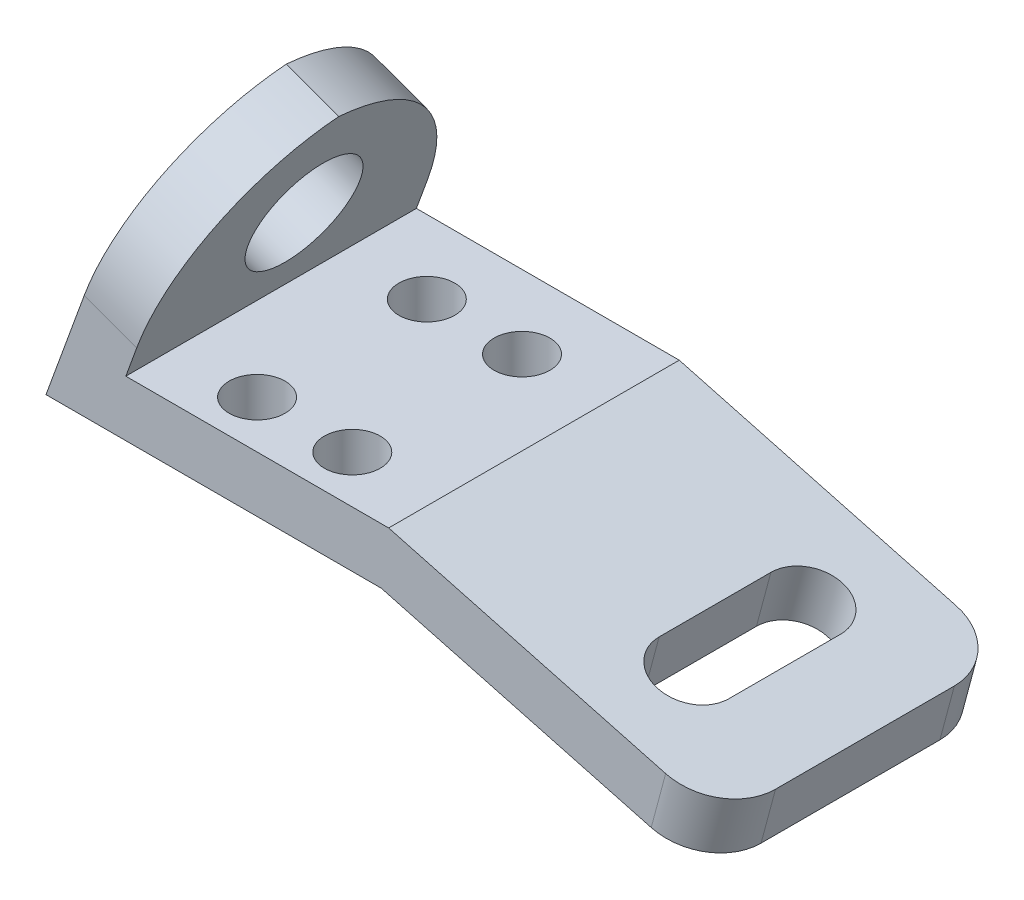
ISO-10303-21;
HEADER;
FILE_DESCRIPTION(('STEP AP214'),'2;1');
FILE_NAME('part.step','',(''),(''),'','','');
FILE_SCHEMA(('AUTOMOTIVE_DESIGN { 1 0 10303 214 1 1 1 1 }'));
ENDSEC;
DATA;
#1=APPLICATION_CONTEXT('core data for automotive mechanical design processes');
#2=APPLICATION_PROTOCOL_DEFINITION('international standard','automotive_design',2000,#1);
#3=PRODUCT_CONTEXT('',#1,'mechanical');
#4=PRODUCT('Part','Part','',(#3));
#5=PRODUCT_RELATED_PRODUCT_CATEGORY('part','',(#4));
#6=PRODUCT_DEFINITION_FORMATION('','',#4);
#7=PRODUCT_DEFINITION_CONTEXT('part definition',#1,'design');
#8=PRODUCT_DEFINITION('design','',#6,#7);
#9=PRODUCT_DEFINITION_SHAPE('','',#8);
#10=(LENGTH_UNIT() NAMED_UNIT(*) SI_UNIT(.MILLI.,.METRE.));
#11=(NAMED_UNIT(*) PLANE_ANGLE_UNIT() SI_UNIT($,.RADIAN.));
#12=(NAMED_UNIT(*) SI_UNIT($,.STERADIAN.) SOLID_ANGLE_UNIT());
#13=UNCERTAINTY_MEASURE_WITH_UNIT(LENGTH_MEASURE(1.E-05),#10,'distance_accuracy_value','');
#14=(GEOMETRIC_REPRESENTATION_CONTEXT(3) GLOBAL_UNCERTAINTY_ASSIGNED_CONTEXT((#13)) GLOBAL_UNIT_ASSIGNED_CONTEXT((#10,
#11,#12)) REPRESENTATION_CONTEXT('',''));
#15=CARTESIAN_POINT('',(0.,0.,0.));
#16=DIRECTION('',(0.,0.,1.));
#17=DIRECTION('',(1.,0.,0.));
#18=AXIS2_PLACEMENT_3D('',#15,#16,#17);
#19=CARTESIAN_POINT('',(9.3969262078591,-3.42020143325666,52.));
#20=DIRECTION('',(-0.93969262078591,0.342020143325666,0.));
#21=DIRECTION('',(-0.342020143325666,-0.93969262078591,0.));
#22=AXIS2_PLACEMENT_3D('',#19,#20,#21);
#23=PLANE('',#22);
#24=CARTESIAN_POINT('',(19.6575305076291,24.7705771903206,25.4846685991559));
#25=DIRECTION('',(-0.93969262078591,0.342020143325666,0.));
#26=DIRECTION('',(-0.342020143325666,-0.93969262078591,0.));
#27=AXIS2_PLACEMENT_3D('',#24,#25,#26);
#28=CIRCLE('',#27,10.);
#29=CARTESIAN_POINT('',(16.2373290743724,15.3736509824615,25.4846685991559));
#30=VERTEX_POINT('',#29);
#31=EDGE_CURVE('E192',#30,#30,#28,.T.);
#32=ORIENTED_EDGE('',*,*,#31,.T.);
#33=EDGE_LOOP('',(#32));
#34=FACE_BOUND('',#33,.T.);
#35=DIRECTION('',(0.342020143325666,0.93969262078591,0.));
#36=VECTOR('',#35,1.);
#37=CARTESIAN_POINT('',(9.3969262078591,-3.42020143325666,0.));
#38=LINE('',#37,#36);
#39=CARTESIAN_POINT('',(14.2814800674211,10.,0.));
#40=VERTEX_POINT('',#39);
#41=CARTESIAN_POINT('',(16.2373290743724,15.3736509824616,0.));
#42=VERTEX_POINT('',#41);
#43=EDGE_CURVE('E195',#40,#42,#38,.T.);
#44=ORIENTED_EDGE('',*,*,#43,.T.);
#45=CARTESIAN_POINT('',(16.2373290743724,15.3736509824615,30.));
#46=DIRECTION('',(-0.93969262078591,0.342020143325666,0.));
#47=DIRECTION('',(-0.342020143325666,-0.93969262078591,0.));
#48=AXIS2_PLACEMENT_3D('',#45,#46,#47);
#49=CIRCLE('',#48,30.);
#50=CARTESIAN_POINT('',(26.4063190016666,43.312721186364,26.));
#51=VERTEX_POINT('',#50);
#52=EDGE_CURVE('E248',#42,#51,#49,.F.);
#53=ORIENTED_EDGE('',*,*,#52,.T.);
#54=CARTESIAN_POINT('',(16.2373290743724,15.3736509824615,22.));
#55=DIRECTION('',(-0.93969262078591,0.342020143325666,0.));
#56=DIRECTION('',(-0.342020143325666,-0.93969262078591,0.));
#57=AXIS2_PLACEMENT_3D('',#54,#55,#56);
#58=CIRCLE('',#57,30.);
#59=CARTESIAN_POINT('',(16.2373290743724,15.3736509824615,52.));
#60=VERTEX_POINT('',#59);
#61=EDGE_CURVE('E246',#51,#60,#58,.F.);
#62=ORIENTED_EDGE('',*,*,#61,.T.);
#63=DIRECTION('',(0.342020143325666,0.93969262078591,0.));
#64=VECTOR('',#63,1.);
#65=CARTESIAN_POINT('',(9.3969262078591,-3.42020143325666,52.));
#66=LINE('',#65,#64);
#67=CARTESIAN_POINT('',(14.2814800674211,10.,52.));
#68=VERTEX_POINT('',#67);
#69=EDGE_CURVE('E199',#68,#60,#66,.T.);
#70=ORIENTED_EDGE('',*,*,#69,.F.);
#71=DIRECTION('',(0.,0.,-1.));
#72=VECTOR('',#71,1.);
#73=CARTESIAN_POINT('',(14.2814800674211,10.,52.));
#74=LINE('',#73,#72);
#75=EDGE_CURVE('E215',#68,#40,#74,.T.);
#76=ORIENTED_EDGE('',*,*,#75,.T.);
#77=EDGE_LOOP('',(#44,#53,#62,#70,#76));
#78=FACE_BOUND('',#77,.T.);
#79=ADVANCED_FACE('F37',(#34,#78),#23,.F.);
#80=CARTESIAN_POINT('',(0.,0.,52.));
#81=DIRECTION('',(-0.93969262078591,0.342020143325666,0.));
#82=DIRECTION('',(-0.342020143325666,-0.93969262078591,0.));
#83=AXIS2_PLACEMENT_3D('',#80,#81,#82);
#84=PLANE('',#83);
#85=CARTESIAN_POINT('',(10.26060429977,28.1907786235773,25.4846685991559));
#86=DIRECTION('',(-0.93969262078591,0.342020143325666,0.));
#87=DIRECTION('',(-0.342020143325666,-0.93969262078591,0.));
#88=AXIS2_PLACEMENT_3D('',#85,#86,#87);
#89=CIRCLE('',#88,10.);
#90=CARTESIAN_POINT('',(6.84040286651331,18.7938524157182,25.4846685991559));
#91=VERTEX_POINT('',#90);
#92=EDGE_CURVE('E196',#91,#91,#89,.T.);
#93=ORIENTED_EDGE('',*,*,#92,.F.);
#94=EDGE_LOOP('',(#93));
#95=FACE_BOUND('',#94,.T.);
#96=CARTESIAN_POINT('',(6.84040286651331,18.7938524157182,22.));
#97=DIRECTION('',(-0.93969262078591,0.342020143325666,0.));
#98=DIRECTION('',(-0.342020143325666,-0.93969262078591,0.));
#99=AXIS2_PLACEMENT_3D('',#96,#97,#98);
#100=CIRCLE('',#99,30.);
#101=CARTESIAN_POINT('',(6.84040286651331,18.7938524157182,52.));
#102=VERTEX_POINT('',#101);
#103=CARTESIAN_POINT('',(17.0093927938075,46.7329226196207,26.));
#104=VERTEX_POINT('',#103);
#105=EDGE_CURVE('E250',#102,#104,#100,.T.);
#106=ORIENTED_EDGE('',*,*,#105,.T.);
#107=CARTESIAN_POINT('',(6.84040286651331,18.7938524157182,30.));
#108=DIRECTION('',(-0.93969262078591,0.342020143325666,0.));
#109=DIRECTION('',(-0.342020143325666,-0.93969262078591,0.));
#110=AXIS2_PLACEMENT_3D('',#107,#108,#109);
#111=CIRCLE('',#110,30.);
#112=CARTESIAN_POINT('',(6.84040286651331,18.7938524157182,0.));
#113=VERTEX_POINT('',#112);
#114=EDGE_CURVE('E252',#104,#113,#111,.T.);
#115=ORIENTED_EDGE('',*,*,#114,.T.);
#116=DIRECTION('',(0.342020143325666,0.93969262078591,0.));
#117=VECTOR('',#116,1.);
#118=CARTESIAN_POINT('',(0.,0.,0.));
#119=LINE('',#118,#117);
#120=CARTESIAN_POINT('',(0.,0.,0.));
#121=VERTEX_POINT('',#120);
#122=EDGE_CURVE('E218',#121,#113,#119,.T.);
#123=ORIENTED_EDGE('',*,*,#122,.F.);
#124=DIRECTION('',(0.,0.,-1.));
#125=VECTOR('',#124,1.);
#126=CARTESIAN_POINT('',(0.,0.,52.));
#127=LINE('',#126,#125);
#128=CARTESIAN_POINT('',(0.,0.,52.));
#129=VERTEX_POINT('',#128);
#130=EDGE_CURVE('E241',#129,#121,#127,.T.);
#131=ORIENTED_EDGE('',*,*,#130,.F.);
#132=DIRECTION('',(0.342020143325666,0.93969262078591,0.));
#133=VECTOR('',#132,1.);
#134=CARTESIAN_POINT('',(0.,0.,52.));
#135=LINE('',#134,#133);
#136=EDGE_CURVE('E202',#129,#102,#135,.T.);
#137=ORIENTED_EDGE('',*,*,#136,.T.);
#138=EDGE_LOOP('',(#106,#115,#123,#131,#137));
#139=FACE_BOUND('',#138,.T.);
#140=ADVANCED_FACE('F309',(#95,#139),#84,.T.);
#141=CARTESIAN_POINT('',(0.,0.,52.));
#142=DIRECTION('',(0.,-1.,0.));
#143=DIRECTION('',(0.,0.,-1.));
#144=AXIS2_PLACEMENT_3D('',#141,#142,#143);
#145=PLANE('',#144);
#146=CARTESIAN_POINT('',(46.316524975874,0.,43.5069921991129));
#147=DIRECTION('',(0.,1.,0.));
#148=DIRECTION('',(0.,0.,1.));
#149=AXIS2_PLACEMENT_3D('',#146,#147,#148);
#150=CIRCLE('',#149,5.);
#151=CARTESIAN_POINT('',(46.316524975874,0.,48.5069921991129));
#152=VERTEX_POINT('',#151);
#153=EDGE_CURVE('E473',#152,#152,#150,.T.);
#154=ORIENTED_EDGE('',*,*,#153,.T.);
#155=EDGE_LOOP('',(#154));
#156=FACE_BOUND('',#155,.T.);
#157=CARTESIAN_POINT('',(46.316524975874,0.,13.1356212507008));
#158=DIRECTION('',(0.,1.,0.));
#159=DIRECTION('',(0.,0.,1.));
#160=AXIS2_PLACEMENT_3D('',#157,#158,#159);
#161=CIRCLE('',#160,5.);
#162=CARTESIAN_POINT('',(46.316524975874,0.,18.1356212507008));
#163=VERTEX_POINT('',#162);
#164=EDGE_CURVE('E494',#163,#163,#161,.T.);
#165=ORIENTED_EDGE('',*,*,#164,.T.);
#166=EDGE_LOOP('',(#165));
#167=FACE_BOUND('',#166,.T.);
#168=CARTESIAN_POINT('',(29.2814800674211,0.,13.1356212507008));
#169=DIRECTION('',(0.,1.,0.));
#170=DIRECTION('',(0.,0.,1.));
#171=AXIS2_PLACEMENT_3D('',#168,#169,#170);
#172=CIRCLE('',#171,5.);
#173=CARTESIAN_POINT('',(29.2814800674211,0.,18.1356212507008));
#174=VERTEX_POINT('',#173);
#175=EDGE_CURVE('E485',#174,#174,#172,.T.);
#176=ORIENTED_EDGE('',*,*,#175,.T.);
#177=EDGE_LOOP('',(#176));
#178=FACE_BOUND('',#177,.T.);
#179=CARTESIAN_POINT('',(29.2814800674211,0.,43.5069921991129));
#180=DIRECTION('',(0.,1.,0.));
#181=DIRECTION('',(0.,0.,1.));
#182=AXIS2_PLACEMENT_3D('',#179,#180,#181);
#183=CIRCLE('',#182,5.);
#184=CARTESIAN_POINT('',(29.2814800674211,0.,48.5069921991129));
#185=VERTEX_POINT('',#184);
#186=EDGE_CURVE('E182',#185,#185,#183,.T.);
#187=ORIENTED_EDGE('',*,*,#186,.T.);
#188=EDGE_LOOP('',(#187));
#189=FACE_BOUND('',#188,.T.);
#190=DIRECTION('',(-1.,0.,0.));
#191=VECTOR('',#190,1.);
#192=CARTESIAN_POINT('',(0.,0.,0.));
#193=LINE('',#192,#191);
#194=CARTESIAN_POINT('',(60.,0.,0.));
#195=VERTEX_POINT('',#194);
#196=EDGE_CURVE('E221',#195,#121,#193,.T.);
#197=ORIENTED_EDGE('',*,*,#196,.F.);
#198=DIRECTION('',(0.,0.,-1.));
#199=VECTOR('',#198,1.);
#200=CARTESIAN_POINT('',(60.,0.,52.));
#201=LINE('',#200,#199);
#202=CARTESIAN_POINT('',(60.,0.,52.));
#203=VERTEX_POINT('',#202);
#204=EDGE_CURVE('E238',#203,#195,#201,.T.);
#205=ORIENTED_EDGE('',*,*,#204,.F.);
#206=DIRECTION('',(-1.,0.,0.));
#207=VECTOR('',#206,1.);
#208=CARTESIAN_POINT('',(0.,0.,52.));
#209=LINE('',#208,#207);
#210=EDGE_CURVE('E206',#203,#129,#209,.T.);
#211=ORIENTED_EDGE('',*,*,#210,.T.);
#212=ORIENTED_EDGE('',*,*,#130,.T.);
#213=EDGE_LOOP('',(#197,#205,#211,#212));
#214=FACE_BOUND('',#213,.T.);
#215=ADVANCED_FACE('F294',(#156,#167,#178,#189,#214),#145,.T.);
#216=CARTESIAN_POINT('',(60.,0.,52.));
#217=DIRECTION('',(-0.258819045102521,-0.965925826289068,0.));
#218=DIRECTION('',(0.965925826289068,-0.258819045102521,0.));
#219=AXIS2_PLACEMENT_3D('',#216,#217,#218);
#220=PLANE('',#219);
#221=CARTESIAN_POINT('',(97.3653675764115,-10.0120200669915,36.));
#222=DIRECTION('',(0.258819045102521,0.965925826289068,0.));
#223=DIRECTION('',(-0.965925826289068,0.258819045102521,0.));
#224=AXIS2_PLACEMENT_3D('',#221,#222,#223);
#225=CIRCLE('',#224,6.45866858633326);
#226=CARTESIAN_POINT('',(91.1267727854303,-8.3403936308431,36.));
#227=VERTEX_POINT('',#226);
#228=CARTESIAN_POINT('',(103.603962367393,-11.68364650314,36.));
#229=VERTEX_POINT('',#228);
#230=EDGE_CURVE('E149',#227,#229,#225,.T.);
#231=ORIENTED_EDGE('',*,*,#230,.T.);
#232=DIRECTION('',(0.,0.,-1.));
#233=VECTOR('',#232,1.);
#234=CARTESIAN_POINT('',(103.603962367393,-11.68364650314,36.));
#235=LINE('',#234,#233);
#236=CARTESIAN_POINT('',(103.603962367393,-11.68364650314,16.));
#237=VERTEX_POINT('',#236);
#238=EDGE_CURVE('E161',#229,#237,#235,.T.);
#239=ORIENTED_EDGE('',*,*,#238,.T.);
#240=CARTESIAN_POINT('',(97.3653675764115,-10.0120200669915,16.));
#241=DIRECTION('',(0.258819045102521,0.965925826289068,0.));
#242=DIRECTION('',(-0.965925826289068,0.258819045102521,0.));
#243=AXIS2_PLACEMENT_3D('',#240,#241,#242);
#244=CIRCLE('',#243,6.45866858633326);
#245=CARTESIAN_POINT('',(91.1267727854303,-8.3403936308431,16.));
#246=VERTEX_POINT('',#245);
#247=EDGE_CURVE('E165',#237,#246,#244,.T.);
#248=ORIENTED_EDGE('',*,*,#247,.T.);
#249=DIRECTION('',(0.,0.,-1.));
#250=VECTOR('',#249,1.);
#251=CARTESIAN_POINT('',(91.1267727854303,-8.3403936308431,36.));
#252=LINE('',#251,#250);
#253=EDGE_CURVE('E157',#227,#246,#252,.T.);
#254=ORIENTED_EDGE('',*,*,#253,.F.);
#255=EDGE_LOOP('',(#231,#239,#248,#254));
#256=FACE_BOUND('',#255,.T.);
#257=DIRECTION('',(-0.965925826289068,0.258819045102521,0.));
#258=VECTOR('',#257,1.);
#259=CARTESIAN_POINT('',(60.,0.,0.));
#260=LINE('',#259,#258);
#261=CARTESIAN_POINT('',(108.296291314453,-12.9409522551261,0.));
#262=VERTEX_POINT('',#261);
#263=EDGE_CURVE('E224',#262,#195,#260,.T.);
#264=ORIENTED_EDGE('',*,*,#263,.F.);
#265=CARTESIAN_POINT('',(108.296291314453,-12.9409522551261,10.));
#266=DIRECTION('',(-0.258819045102521,-0.965925826289068,0.));
#267=DIRECTION('',(0.965925826289068,-0.258819045102521,0.));
#268=AXIS2_PLACEMENT_3D('',#265,#266,#267);
#269=CIRCLE('',#268,10.);
#270=CARTESIAN_POINT('',(117.955549577344,-15.5291427061513,9.99999999999999));
#271=VERTEX_POINT('',#270);
#272=EDGE_CURVE('E263',#262,#271,#269,.T.);
#273=ORIENTED_EDGE('',*,*,#272,.T.);
#274=DIRECTION('',(0.,0.,-1.));
#275=VECTOR('',#274,1.);
#276=CARTESIAN_POINT('',(117.955549577344,-15.5291427061513,52.));
#277=LINE('',#276,#275);
#278=CARTESIAN_POINT('',(117.955549577344,-15.5291427061513,42.));
#279=VERTEX_POINT('',#278);
#280=EDGE_CURVE('E236',#279,#271,#277,.T.);
#281=ORIENTED_EDGE('',*,*,#280,.F.);
#282=CARTESIAN_POINT('',(108.296291314453,-12.9409522551261,42.));
#283=DIRECTION('',(-0.258819045102521,-0.965925826289068,0.));
#284=DIRECTION('',(0.965925826289068,-0.258819045102521,0.));
#285=AXIS2_PLACEMENT_3D('',#282,#283,#284);
#286=CIRCLE('',#285,10.);
#287=CARTESIAN_POINT('',(108.296291314453,-12.9409522551261,52.));
#288=VERTEX_POINT('',#287);
#289=EDGE_CURVE('E261',#279,#288,#286,.T.);
#290=ORIENTED_EDGE('',*,*,#289,.T.);
#291=DIRECTION('',(-0.965925826289068,0.258819045102521,0.));
#292=VECTOR('',#291,1.);
#293=CARTESIAN_POINT('',(60.,0.,52.));
#294=LINE('',#293,#292);
#295=EDGE_CURVE('E209',#288,#203,#294,.T.);
#296=ORIENTED_EDGE('',*,*,#295,.T.);
#297=ORIENTED_EDGE('',*,*,#204,.T.);
#298=EDGE_LOOP('',(#264,#273,#281,#290,#296,#297));
#299=FACE_BOUND('',#298,.T.);
#300=ADVANCED_FACE('F167',(#256,#299),#220,.T.);
#301=CARTESIAN_POINT('',(120.543740028369,-5.86988444326059,52.));
#302=DIRECTION('',(0.965925826289068,-0.258819045102521,0.));
#303=DIRECTION('',(0.258819045102521,0.965925826289068,0.));
#304=AXIS2_PLACEMENT_3D('',#301,#302,#303);
#305=PLANE('',#304);
#306=ORIENTED_EDGE('',*,*,#280,.T.);
#307=DIRECTION('',(-0.258819045102521,-0.965925826289068,0.));
#308=VECTOR('',#307,1.);
#309=CARTESIAN_POINT('',(120.543740028369,-5.86988444326059,9.99999999999999));
#310=LINE('',#309,#308);
#311=CARTESIAN_POINT('',(120.543740028369,-5.86988444326059,9.99999999999999));
#312=VERTEX_POINT('',#311);
#313=EDGE_CURVE('E58',#271,#312,#310,.F.);
#314=ORIENTED_EDGE('',*,*,#313,.T.);
#315=DIRECTION('',(0.,0.,-1.));
#316=VECTOR('',#315,1.);
#317=CARTESIAN_POINT('',(120.543740028369,-5.86988444326059,52.));
#318=LINE('',#317,#316);
#319=CARTESIAN_POINT('',(120.543740028369,-5.86988444326059,42.));
#320=VERTEX_POINT('',#319);
#321=EDGE_CURVE('E234',#320,#312,#318,.T.);
#322=ORIENTED_EDGE('',*,*,#321,.F.);
#323=DIRECTION('',(-0.258819045102521,-0.965925826289068,0.));
#324=VECTOR('',#323,1.);
#325=CARTESIAN_POINT('',(117.955549577344,-15.5291427061513,42.));
#326=LINE('',#325,#324);
#327=EDGE_CURVE('E265',#320,#279,#326,.T.);
#328=ORIENTED_EDGE('',*,*,#327,.T.);
#329=EDGE_LOOP('',(#306,#314,#322,#328));
#330=FACE_BOUND('',#329,.T.);
#331=ADVANCED_FACE('F284',(#330),#305,.T.);
#332=CARTESIAN_POINT('',(62.5881904510252,9.65925826289068,52.));
#333=DIRECTION('',(-0.258819045102521,-0.965925826289068,0.));
#334=DIRECTION('',(0.965925826289068,-0.258819045102521,0.));
#335=AXIS2_PLACEMENT_3D('',#332,#333,#334);
#336=PLANE('',#335);
#337=DIRECTION('',(0.,0.,-1.));
#338=VECTOR('',#337,1.);
#339=CARTESIAN_POINT('',(106.192152818418,-2.02438824024927,36.));
#340=LINE('',#339,#338);
#341=CARTESIAN_POINT('',(106.192152818418,-2.02438824024928,36.));
#342=VERTEX_POINT('',#341);
#343=CARTESIAN_POINT('',(106.192152818418,-2.02438824024927,16.));
#344=VERTEX_POINT('',#343);
#345=EDGE_CURVE('E181',#342,#344,#340,.T.);
#346=ORIENTED_EDGE('',*,*,#345,.F.);
#347=CARTESIAN_POINT('',(99.9535580274367,-0.352761804100845,36.));
#348=DIRECTION('',(0.258819045102521,0.965925826289068,0.));
#349=DIRECTION('',(-0.965925826289068,0.258819045102521,0.));
#350=AXIS2_PLACEMENT_3D('',#347,#348,#349);
#351=CIRCLE('',#350,6.45866858633326);
#352=CARTESIAN_POINT('',(93.7149632364555,1.31886463204758,36.));
#353=VERTEX_POINT('',#352);
#354=EDGE_CURVE('E152',#353,#342,#351,.T.);
#355=ORIENTED_EDGE('',*,*,#354,.F.);
#356=DIRECTION('',(0.,0.,-1.));
#357=VECTOR('',#356,1.);
#358=CARTESIAN_POINT('',(93.7149632364555,1.31886463204758,36.));
#359=LINE('',#358,#357);
#360=CARTESIAN_POINT('',(93.7149632364555,1.31886463204758,16.));
#361=VERTEX_POINT('',#360);
#362=EDGE_CURVE('E169',#353,#361,#359,.T.);
#363=ORIENTED_EDGE('',*,*,#362,.T.);
#364=CARTESIAN_POINT('',(99.9535580274367,-0.352761804100845,16.));
#365=DIRECTION('',(0.258819045102521,0.965925826289068,0.));
#366=DIRECTION('',(-0.965925826289068,0.258819045102521,0.));
#367=AXIS2_PLACEMENT_3D('',#364,#365,#366);
#368=CIRCLE('',#367,6.45866858633326);
#369=EDGE_CURVE('E172',#344,#361,#368,.T.);
#370=ORIENTED_EDGE('',*,*,#369,.F.);
#371=EDGE_LOOP('',(#346,#355,#363,#370));
#372=FACE_BOUND('',#371,.T.);
#373=ORIENTED_EDGE('',*,*,#321,.T.);
#374=CARTESIAN_POINT('',(110.884481765479,-3.28169399223539,10.));
#375=DIRECTION('',(-0.258819045102521,-0.965925826289068,0.));
#376=DIRECTION('',(0.965925826289068,-0.258819045102521,0.));
#377=AXIS2_PLACEMENT_3D('',#374,#375,#376);
#378=CIRCLE('',#377,10.);
#379=CARTESIAN_POINT('',(110.884481765479,-3.28169399223539,0.));
#380=VERTEX_POINT('',#379);
#381=EDGE_CURVE('E45',#312,#380,#378,.F.);
#382=ORIENTED_EDGE('',*,*,#381,.T.);
#383=DIRECTION('',(-0.965925826289068,0.258819045102521,0.));
#384=VECTOR('',#383,1.);
#385=CARTESIAN_POINT('',(62.5881904510252,9.65925826289068,0.));
#386=LINE('',#385,#384);
#387=CARTESIAN_POINT('',(61.316524975874,10.,0.));
#388=VERTEX_POINT('',#387);
#389=EDGE_CURVE('E226',#380,#388,#386,.T.);
#390=ORIENTED_EDGE('',*,*,#389,.T.);
#391=DIRECTION('',(0.,0.,-1.));
#392=VECTOR('',#391,1.);
#393=CARTESIAN_POINT('',(61.316524975874,10.,52.));
#394=LINE('',#393,#392);
#395=CARTESIAN_POINT('',(61.316524975874,10.,52.));
#396=VERTEX_POINT('',#395);
#397=EDGE_CURVE('E231',#396,#388,#394,.T.);
#398=ORIENTED_EDGE('',*,*,#397,.F.);
#399=DIRECTION('',(-0.965925826289068,0.258819045102521,0.));
#400=VECTOR('',#399,1.);
#401=CARTESIAN_POINT('',(62.5881904510252,9.65925826289068,52.));
#402=LINE('',#401,#400);
#403=CARTESIAN_POINT('',(110.884481765479,-3.28169399223538,52.));
#404=VERTEX_POINT('',#403);
#405=EDGE_CURVE('E211',#404,#396,#402,.T.);
#406=ORIENTED_EDGE('',*,*,#405,.F.);
#407=CARTESIAN_POINT('',(110.884481765479,-3.28169399223538,42.));
#408=DIRECTION('',(-0.258819045102521,-0.965925826289068,0.));
#409=DIRECTION('',(0.965925826289068,-0.258819045102521,0.));
#410=AXIS2_PLACEMENT_3D('',#407,#408,#409);
#411=CIRCLE('',#410,10.);
#412=EDGE_CURVE('E269',#404,#320,#411,.F.);
#413=ORIENTED_EDGE('',*,*,#412,.T.);
#414=EDGE_LOOP('',(#373,#382,#390,#398,#406,#413));
#415=FACE_BOUND('',#414,.T.);
#416=ADVANCED_FACE('F273',(#372,#415),#336,.F.);
#417=CARTESIAN_POINT('',(0.,10.,52.));
#418=DIRECTION('',(0.,-1.,0.));
#419=DIRECTION('',(0.,0.,-1.));
#420=AXIS2_PLACEMENT_3D('',#417,#418,#419);
#421=PLANE('',#420);
#422=CARTESIAN_POINT('',(46.316524975874,10.,43.5069921991129));
#423=DIRECTION('',(0.,1.,0.));
#424=DIRECTION('',(0.,0.,1.));
#425=AXIS2_PLACEMENT_3D('',#422,#423,#424);
#426=CIRCLE('',#425,5.);
#427=CARTESIAN_POINT('',(46.316524975874,10.,48.5069921991129));
#428=VERTEX_POINT('',#427);
#429=EDGE_CURVE('E476',#428,#428,#426,.T.);
#430=ORIENTED_EDGE('',*,*,#429,.F.);
#431=EDGE_LOOP('',(#430));
#432=FACE_BOUND('',#431,.T.);
#433=CARTESIAN_POINT('',(46.316524975874,10.,13.1356212507008));
#434=DIRECTION('',(0.,1.,0.));
#435=DIRECTION('',(0.,0.,1.));
#436=AXIS2_PLACEMENT_3D('',#433,#434,#435);
#437=CIRCLE('',#436,5.);
#438=CARTESIAN_POINT('',(46.316524975874,10.,18.1356212507008));
#439=VERTEX_POINT('',#438);
#440=EDGE_CURVE('E478',#439,#439,#437,.T.);
#441=ORIENTED_EDGE('',*,*,#440,.F.);
#442=EDGE_LOOP('',(#441));
#443=FACE_BOUND('',#442,.T.);
#444=CARTESIAN_POINT('',(29.2814800674211,10.,13.1356212507008));
#445=DIRECTION('',(0.,1.,0.));
#446=DIRECTION('',(0.,0.,1.));
#447=AXIS2_PLACEMENT_3D('',#444,#445,#446);
#448=CIRCLE('',#447,5.);
#449=CARTESIAN_POINT('',(29.2814800674211,10.,18.1356212507008));
#450=VERTEX_POINT('',#449);
#451=EDGE_CURVE('E489',#450,#450,#448,.T.);
#452=ORIENTED_EDGE('',*,*,#451,.F.);
#453=EDGE_LOOP('',(#452));
#454=FACE_BOUND('',#453,.T.);
#455=CARTESIAN_POINT('',(29.2814800674211,10.,43.5069921991129));
#456=DIRECTION('',(0.,1.,0.));
#457=DIRECTION('',(0.,0.,1.));
#458=AXIS2_PLACEMENT_3D('',#455,#456,#457);
#459=CIRCLE('',#458,5.);
#460=CARTESIAN_POINT('',(29.2814800674211,10.,48.5069921991129));
#461=VERTEX_POINT('',#460);
#462=EDGE_CURVE('E175',#461,#461,#459,.T.);
#463=ORIENTED_EDGE('',*,*,#462,.F.);
#464=EDGE_LOOP('',(#463));
#465=FACE_BOUND('',#464,.T.);
#466=DIRECTION('',(1.,0.,0.));
#467=VECTOR('',#466,1.);
#468=CARTESIAN_POINT('',(0.,10.,0.));
#469=LINE('',#468,#467);
#470=EDGE_CURVE('E203',#388,#40,#469,.F.);
#471=ORIENTED_EDGE('',*,*,#470,.T.);
#472=ORIENTED_EDGE('',*,*,#75,.F.);
#473=DIRECTION('',(1.,0.,0.));
#474=VECTOR('',#473,1.);
#475=CARTESIAN_POINT('',(0.,10.,52.));
#476=LINE('',#475,#474);
#477=EDGE_CURVE('E213',#396,#68,#476,.F.);
#478=ORIENTED_EDGE('',*,*,#477,.F.);
#479=ORIENTED_EDGE('',*,*,#397,.T.);
#480=EDGE_LOOP('',(#471,#472,#478,#479));
#481=FACE_BOUND('',#480,.T.);
#482=ADVANCED_FACE('F351',(#432,#443,#454,#465,#481),#421,.F.);
#483=CARTESIAN_POINT('',(0.,0.,52.));
#484=DIRECTION('',(0.,0.,-1.));
#485=DIRECTION('',(-1.,0.,0.));
#486=AXIS2_PLACEMENT_3D('',#483,#484,#485);
#487=PLANE('',#486);
#488=ORIENTED_EDGE('',*,*,#295,.F.);
#489=DIRECTION('',(-0.258819045102521,-0.965925826289068,0.));
#490=VECTOR('',#489,1.);
#491=CARTESIAN_POINT('',(110.884481765479,-3.28169399223538,52.));
#492=LINE('',#491,#490);
#493=EDGE_CURVE('E11',#288,#404,#492,.F.);
#494=ORIENTED_EDGE('',*,*,#493,.T.);
#495=ORIENTED_EDGE('',*,*,#405,.T.);
#496=ORIENTED_EDGE('',*,*,#477,.T.);
#497=ORIENTED_EDGE('',*,*,#69,.T.);
#498=DIRECTION('',(0.93969262078591,-0.342020143325665,0.));
#499=VECTOR('',#498,1.);
#500=CARTESIAN_POINT('',(6.84040286651333,18.7938524157182,52.));
#501=LINE('',#500,#499);
#502=EDGE_CURVE('E254',#60,#102,#501,.F.);
#503=ORIENTED_EDGE('',*,*,#502,.T.);
#504=ORIENTED_EDGE('',*,*,#136,.F.);
#505=ORIENTED_EDGE('',*,*,#210,.F.);
#506=EDGE_LOOP('',(#488,#494,#495,#496,#497,#503,#504,#505));
#507=FACE_BOUND('',#506,.T.);
#508=ADVANCED_FACE('F290',(#507),#487,.F.);
#509=CARTESIAN_POINT('',(0.,0.,0.));
#510=DIRECTION('',(0.,0.,-1.));
#511=DIRECTION('',(-1.,0.,0.));
#512=AXIS2_PLACEMENT_3D('',#509,#510,#511);
#513=PLANE('',#512);
#514=ORIENTED_EDGE('',*,*,#389,.F.);
#515=DIRECTION('',(-0.258819045102521,-0.965925826289068,0.));
#516=VECTOR('',#515,1.);
#517=CARTESIAN_POINT('',(104.277053427987,-27.940952255126,0.));
#518=LINE('',#517,#516);
#519=EDGE_CURVE('E256',#380,#262,#518,.T.);
#520=ORIENTED_EDGE('',*,*,#519,.T.);
#521=ORIENTED_EDGE('',*,*,#263,.T.);
#522=ORIENTED_EDGE('',*,*,#196,.T.);
#523=ORIENTED_EDGE('',*,*,#122,.T.);
#524=DIRECTION('',(0.93969262078591,-0.342020143325665,0.));
#525=VECTOR('',#524,1.);
#526=CARTESIAN_POINT('',(6.8404028665133,18.7938524157182,0.));
#527=LINE('',#526,#525);
#528=EDGE_CURVE('E243',#113,#42,#527,.T.);
#529=ORIENTED_EDGE('',*,*,#528,.T.);
#530=ORIENTED_EDGE('',*,*,#43,.F.);
#531=ORIENTED_EDGE('',*,*,#470,.F.);
#532=EDGE_LOOP('',(#514,#520,#521,#522,#523,#529,#530,#531));
#533=FACE_BOUND('',#532,.T.);
#534=ADVANCED_FACE('F279',(#533),#513,.T.);
#535=CARTESIAN_POINT('',(19.6575305076291,24.7705771903206,25.4846685991559));
#536=DIRECTION('',(-0.93969262078591,0.342020143325666,0.));
#537=DIRECTION('',(-0.342020143325666,-0.93969262078591,0.));
#538=AXIS2_PLACEMENT_3D('',#535,#536,#537);
#539=CYLINDRICAL_SURFACE('',#538,10.);
#540=ORIENTED_EDGE('',*,*,#31,.F.);
#541=EDGE_LOOP('',(#540));
#542=FACE_BOUND('',#541,.T.);
#543=ORIENTED_EDGE('',*,*,#92,.T.);
#544=EDGE_LOOP('',(#543));
#545=FACE_BOUND('',#544,.T.);
#546=ADVANCED_FACE('F327',(#542,#545),#539,.F.);
#547=CARTESIAN_POINT('',(6.84040286651333,18.7938524157182,22.));
#548=DIRECTION('',(-0.93969262078591,0.342020143325665,0.));
#549=DIRECTION('',(-0.342020143325665,-0.93969262078591,0.));
#550=AXIS2_PLACEMENT_3D('',#547,#548,#549);
#551=CYLINDRICAL_SURFACE('',#550,30.);
#552=DIRECTION('',(-0.93969262078591,0.342020143325665,0.));
#553=VECTOR('',#552,1.);
#554=CARTESIAN_POINT('',(21.707855897737,45.0228219029923,26.));
#555=LINE('',#554,#553);
#556=EDGE_CURVE('E188',#104,#51,#555,.F.);
#557=ORIENTED_EDGE('',*,*,#556,.F.);
#558=ORIENTED_EDGE('',*,*,#105,.F.);
#559=ORIENTED_EDGE('',*,*,#502,.F.);
#560=ORIENTED_EDGE('',*,*,#61,.F.);
#561=EDGE_LOOP('',(#557,#558,#559,#560));
#562=FACE_BOUND('',#561,.T.);
#563=ADVANCED_FACE('F307',(#562),#551,.T.);
#564=CARTESIAN_POINT('',(6.8404028665133,18.7938524157182,30.));
#565=DIRECTION('',(0.93969262078591,-0.342020143325665,0.));
#566=DIRECTION('',(0.342020143325665,0.93969262078591,0.));
#567=AXIS2_PLACEMENT_3D('',#564,#565,#566);
#568=CYLINDRICAL_SURFACE('',#567,30.);
#569=ORIENTED_EDGE('',*,*,#114,.F.);
#570=ORIENTED_EDGE('',*,*,#556,.T.);
#571=ORIENTED_EDGE('',*,*,#52,.F.);
#572=ORIENTED_EDGE('',*,*,#528,.F.);
#573=EDGE_LOOP('',(#569,#570,#571,#572));
#574=FACE_BOUND('',#573,.T.);
#575=ADVANCED_FACE('F300',(#574),#568,.T.);
#576=CARTESIAN_POINT('',(97.3653675764115,-10.0120200669915,36.));
#577=DIRECTION('',(0.258819045102521,0.965925826289068,0.));
#578=DIRECTION('',(-0.965925826289068,0.258819045102521,0.));
#579=AXIS2_PLACEMENT_3D('',#576,#577,#578);
#580=CYLINDRICAL_SURFACE('',#579,6.45866858633326);
#581=ORIENTED_EDGE('',*,*,#354,.T.);
#582=DIRECTION('',(0.258819045102521,0.965925826289068,0.));
#583=VECTOR('',#582,1.);
#584=CARTESIAN_POINT('',(103.603962367393,-11.68364650314,36.));
#585=LINE('',#584,#583);
#586=EDGE_CURVE('E145',#229,#342,#585,.T.);
#587=ORIENTED_EDGE('',*,*,#586,.F.);
#588=ORIENTED_EDGE('',*,*,#230,.F.);
#589=DIRECTION('',(0.258819045102521,0.965925826289068,0.));
#590=VECTOR('',#589,1.);
#591=CARTESIAN_POINT('',(91.1267727854303,-8.3403936308431,36.));
#592=LINE('',#591,#590);
#593=EDGE_CURVE('E186',#227,#353,#592,.T.);
#594=ORIENTED_EDGE('',*,*,#593,.T.);
#595=EDGE_LOOP('',(#581,#587,#588,#594));
#596=FACE_BOUND('',#595,.T.);
#597=ADVANCED_FACE('F147',(#596),#580,.F.);
#598=CARTESIAN_POINT('',(91.1267727854303,-8.3403936308431,36.));
#599=DIRECTION('',(0.965925826289068,-0.258819045102521,0.));
#600=DIRECTION('',(0.258819045102521,0.965925826289068,0.));
#601=AXIS2_PLACEMENT_3D('',#598,#599,#600);
#602=PLANE('',#601);
#603=ORIENTED_EDGE('',*,*,#362,.F.);
#604=ORIENTED_EDGE('',*,*,#593,.F.);
#605=ORIENTED_EDGE('',*,*,#253,.T.);
#606=DIRECTION('',(0.258819045102521,0.965925826289068,0.));
#607=VECTOR('',#606,1.);
#608=CARTESIAN_POINT('',(91.1267727854303,-8.3403936308431,16.));
#609=LINE('',#608,#607);
#610=EDGE_CURVE('E189',#246,#361,#609,.T.);
#611=ORIENTED_EDGE('',*,*,#610,.T.);
#612=EDGE_LOOP('',(#603,#604,#605,#611));
#613=FACE_BOUND('',#612,.T.);
#614=ADVANCED_FACE('F339',(#613),#602,.T.);
#615=CARTESIAN_POINT('',(97.3653675764115,-10.0120200669915,16.));
#616=DIRECTION('',(0.258819045102521,0.965925826289068,0.));
#617=DIRECTION('',(-0.965925826289068,0.258819045102521,0.));
#618=AXIS2_PLACEMENT_3D('',#615,#616,#617);
#619=CYLINDRICAL_SURFACE('',#618,6.45866858633326);
#620=ORIENTED_EDGE('',*,*,#369,.T.);
#621=ORIENTED_EDGE('',*,*,#610,.F.);
#622=ORIENTED_EDGE('',*,*,#247,.F.);
#623=DIRECTION('',(0.258819045102521,0.965925826289068,0.));
#624=VECTOR('',#623,1.);
#625=CARTESIAN_POINT('',(103.603962367393,-11.68364650314,16.));
#626=LINE('',#625,#624);
#627=EDGE_CURVE('E156',#237,#344,#626,.T.);
#628=ORIENTED_EDGE('',*,*,#627,.T.);
#629=EDGE_LOOP('',(#620,#621,#622,#628));
#630=FACE_BOUND('',#629,.T.);
#631=ADVANCED_FACE('F334',(#630),#619,.F.);
#632=CARTESIAN_POINT('',(103.603962367393,-11.68364650314,36.));
#633=DIRECTION('',(0.965925826289068,-0.258819045102521,0.));
#634=DIRECTION('',(0.258819045102521,0.965925826289068,0.));
#635=AXIS2_PLACEMENT_3D('',#632,#633,#634);
#636=PLANE('',#635);
#637=ORIENTED_EDGE('',*,*,#345,.T.);
#638=ORIENTED_EDGE('',*,*,#627,.F.);
#639=ORIENTED_EDGE('',*,*,#238,.F.);
#640=ORIENTED_EDGE('',*,*,#586,.T.);
#641=EDGE_LOOP('',(#637,#638,#639,#640));
#642=FACE_BOUND('',#641,.T.);
#643=ADVANCED_FACE('F162',(#642),#636,.F.);
#644=CARTESIAN_POINT('',(104.277053427987,-27.940952255126,10.));
#645=DIRECTION('',(-0.258819045102521,-0.965925826289068,0.));
#646=DIRECTION('',(0.965925826289068,-0.258819045102521,0.));
#647=AXIS2_PLACEMENT_3D('',#644,#645,#646);
#648=CYLINDRICAL_SURFACE('',#647,10.);
#649=ORIENTED_EDGE('',*,*,#381,.F.);
#650=ORIENTED_EDGE('',*,*,#313,.F.);
#651=ORIENTED_EDGE('',*,*,#272,.F.);
#652=ORIENTED_EDGE('',*,*,#519,.F.);
#653=EDGE_LOOP('',(#649,#650,#651,#652));
#654=FACE_BOUND('',#653,.T.);
#655=ADVANCED_FACE('F282',(#654),#648,.T.);
#656=CARTESIAN_POINT('',(110.884481765479,-3.28169399223539,42.));
#657=DIRECTION('',(0.258819045102521,0.965925826289068,0.));
#658=DIRECTION('',(-0.965925826289068,0.258819045102521,0.));
#659=AXIS2_PLACEMENT_3D('',#656,#657,#658);
#660=CYLINDRICAL_SURFACE('',#659,10.);
#661=ORIENTED_EDGE('',*,*,#412,.F.);
#662=ORIENTED_EDGE('',*,*,#493,.F.);
#663=ORIENTED_EDGE('',*,*,#289,.F.);
#664=ORIENTED_EDGE('',*,*,#327,.F.);
#665=EDGE_LOOP('',(#661,#662,#663,#664));
#666=FACE_BOUND('',#665,.T.);
#667=ADVANCED_FACE('F39',(#666),#660,.T.);
#668=CARTESIAN_POINT('',(29.2814800674211,0.,43.5069921991129));
#669=DIRECTION('',(0.,1.,0.));
#670=DIRECTION('',(0.,0.,1.));
#671=AXIS2_PLACEMENT_3D('',#668,#669,#670);
#672=CYLINDRICAL_SURFACE('',#671,5.);
#673=ORIENTED_EDGE('',*,*,#186,.F.);
#674=EDGE_LOOP('',(#673));
#675=FACE_BOUND('',#674,.T.);
#676=ORIENTED_EDGE('',*,*,#462,.T.);
#677=EDGE_LOOP('',(#676));
#678=FACE_BOUND('',#677,.T.);
#679=ADVANCED_FACE('F333',(#675,#678),#672,.F.);
#680=CARTESIAN_POINT('',(29.2814800674211,0.,13.1356212507008));
#681=DIRECTION('',(0.,1.,0.));
#682=DIRECTION('',(0.,0.,1.));
#683=AXIS2_PLACEMENT_3D('',#680,#681,#682);
#684=CYLINDRICAL_SURFACE('',#683,5.);
#685=ORIENTED_EDGE('',*,*,#175,.F.);
#686=EDGE_LOOP('',(#685));
#687=FACE_BOUND('',#686,.T.);
#688=ORIENTED_EDGE('',*,*,#451,.T.);
#689=EDGE_LOOP('',(#688));
#690=FACE_BOUND('',#689,.T.);
#691=ADVANCED_FACE('F436',(#687,#690),#684,.F.);
#692=CARTESIAN_POINT('',(46.316524975874,0.,13.1356212507008));
#693=DIRECTION('',(0.,1.,0.));
#694=DIRECTION('',(0.,0.,1.));
#695=AXIS2_PLACEMENT_3D('',#692,#693,#694);
#696=CYLINDRICAL_SURFACE('',#695,5.);
#697=ORIENTED_EDGE('',*,*,#164,.F.);
#698=EDGE_LOOP('',(#697));
#699=FACE_BOUND('',#698,.T.);
#700=ORIENTED_EDGE('',*,*,#440,.T.);
#701=EDGE_LOOP('',(#700));
#702=FACE_BOUND('',#701,.T.);
#703=ADVANCED_FACE('F445',(#699,#702),#696,.F.);
#704=CARTESIAN_POINT('',(46.316524975874,0.,43.5069921991129));
#705=DIRECTION('',(0.,1.,0.));
#706=DIRECTION('',(0.,0.,1.));
#707=AXIS2_PLACEMENT_3D('',#704,#705,#706);
#708=CYLINDRICAL_SURFACE('',#707,5.);
#709=ORIENTED_EDGE('',*,*,#153,.F.);
#710=EDGE_LOOP('',(#709));
#711=FACE_BOUND('',#710,.T.);
#712=ORIENTED_EDGE('',*,*,#429,.T.);
#713=EDGE_LOOP('',(#712));
#714=FACE_BOUND('',#713,.T.);
#715=ADVANCED_FACE('F454',(#711,#714),#708,.F.);
#716=CLOSED_SHELL('',(#79,#140,#215,#300,#331,#416,#482,#508,#534,#546,#563,#575,#597,#614,#631,
#643,#655,#667,#679,#691,#703,#715));
#717=MANIFOLD_SOLID_BREP('B2',#716);
#718=ADVANCED_BREP_SHAPE_REPRESENTATION('',(#18,#717),#14);
#719=SHAPE_DEFINITION_REPRESENTATION(#9,#718);
ENDSEC;
END-ISO-10303-21;
